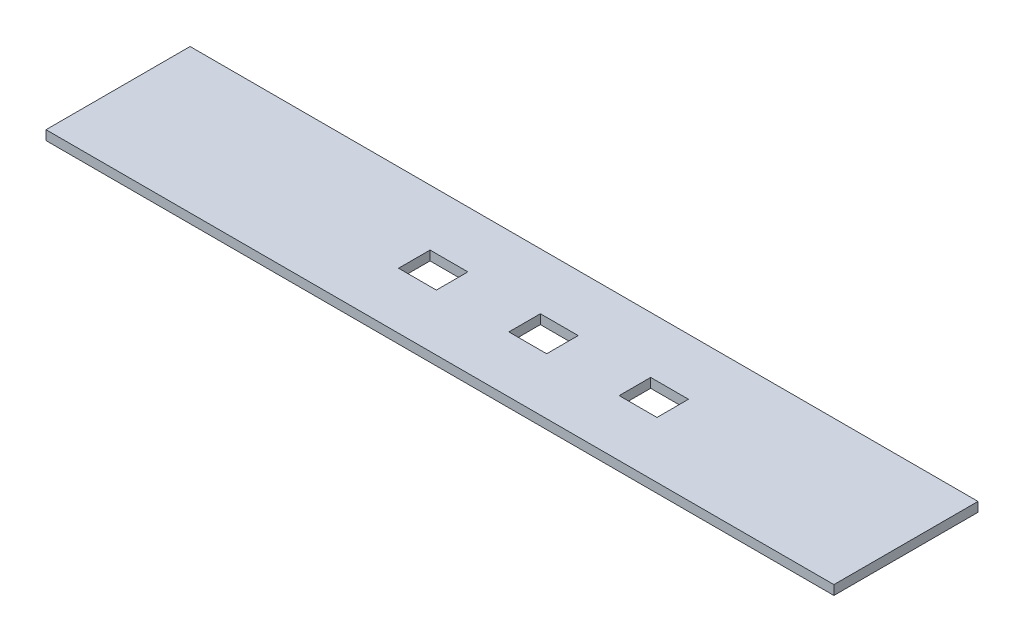
ISO-10303-21;
HEADER;
FILE_DESCRIPTION(('STEP AP214'),'2;1');
FILE_NAME('part.step','',(''),(''),'','','');
FILE_SCHEMA(('AUTOMOTIVE_DESIGN { 1 0 10303 214 1 1 1 1 }'));
ENDSEC;
DATA;
#1=APPLICATION_CONTEXT('core data for automotive mechanical design processes');
#2=APPLICATION_PROTOCOL_DEFINITION('international standard','automotive_design',2000,#1);
#3=PRODUCT_CONTEXT('',#1,'mechanical');
#4=PRODUCT('Part','Part','',(#3));
#5=PRODUCT_RELATED_PRODUCT_CATEGORY('part','',(#4));
#6=PRODUCT_DEFINITION_FORMATION('','',#4);
#7=PRODUCT_DEFINITION_CONTEXT('part definition',#1,'design');
#8=PRODUCT_DEFINITION('design','',#6,#7);
#9=PRODUCT_DEFINITION_SHAPE('','',#8);
#10=(LENGTH_UNIT() NAMED_UNIT(*) SI_UNIT(.MILLI.,.METRE.));
#11=(NAMED_UNIT(*) PLANE_ANGLE_UNIT() SI_UNIT($,.RADIAN.));
#12=(NAMED_UNIT(*) SI_UNIT($,.STERADIAN.) SOLID_ANGLE_UNIT());
#13=UNCERTAINTY_MEASURE_WITH_UNIT(LENGTH_MEASURE(1.E-05),#10,'distance_accuracy_value','');
#14=(GEOMETRIC_REPRESENTATION_CONTEXT(3) GLOBAL_UNCERTAINTY_ASSIGNED_CONTEXT((#13)) GLOBAL_UNIT_ASSIGNED_CONTEXT((#10,
#11,#12)) REPRESENTATION_CONTEXT('',''));
#15=CARTESIAN_POINT('',(0.,0.,0.));
#16=DIRECTION('',(0.,0.,1.));
#17=DIRECTION('',(1.,0.,0.));
#18=AXIS2_PLACEMENT_3D('',#15,#16,#17);
#19=CARTESIAN_POINT('',(-125.,3.,-22.86));
#20=DIRECTION('',(1.,0.,0.));
#21=DIRECTION('',(0.,0.,-1.));
#22=AXIS2_PLACEMENT_3D('',#19,#20,#21);
#23=PLANE('',#22);
#24=DIRECTION('',(0.,0.,1.));
#25=VECTOR('',#24,1.);
#26=CARTESIAN_POINT('',(-125.,0.,-22.86));
#27=LINE('',#26,#25);
#28=CARTESIAN_POINT('',(-125.,0.,-22.86));
#29=VERTEX_POINT('',#28);
#30=CARTESIAN_POINT('',(-125.,0.,22.86));
#31=VERTEX_POINT('',#30);
#32=EDGE_CURVE('E194',#29,#31,#27,.T.);
#33=ORIENTED_EDGE('',*,*,#32,.T.);
#34=DIRECTION('',(0.,-1.,0.));
#35=VECTOR('',#34,1.);
#36=CARTESIAN_POINT('',(-125.,3.,22.86));
#37=LINE('',#36,#35);
#38=CARTESIAN_POINT('',(-125.,3.,22.86));
#39=VERTEX_POINT('',#38);
#40=EDGE_CURVE('E292',#39,#31,#37,.T.);
#41=ORIENTED_EDGE('',*,*,#40,.F.);
#42=DIRECTION('',(0.,0.,1.));
#43=VECTOR('',#42,1.);
#44=CARTESIAN_POINT('',(-125.,3.,-22.86));
#45=LINE('',#44,#43);
#46=CARTESIAN_POINT('',(-125.,3.,-22.86));
#47=VERTEX_POINT('',#46);
#48=EDGE_CURVE('E253',#47,#39,#45,.T.);
#49=ORIENTED_EDGE('',*,*,#48,.F.);
#50=DIRECTION('',(0.,-1.,0.));
#51=VECTOR('',#50,1.);
#52=CARTESIAN_POINT('',(-125.,3.,-22.86));
#53=LINE('',#52,#51);
#54=EDGE_CURVE('E269',#47,#29,#53,.T.);
#55=ORIENTED_EDGE('',*,*,#54,.T.);
#56=EDGE_LOOP('',(#33,#41,#49,#55));
#57=FACE_BOUND('',#56,.T.);
#58=ADVANCED_FACE('F45',(#57),#23,.F.);
#59=CARTESIAN_POINT('',(-125.,3.,22.86));
#60=DIRECTION('',(0.,0.,-1.));
#61=DIRECTION('',(-1.,0.,0.));
#62=AXIS2_PLACEMENT_3D('',#59,#60,#61);
#63=PLANE('',#62);
#64=DIRECTION('',(1.,0.,0.));
#65=VECTOR('',#64,1.);
#66=CARTESIAN_POINT('',(-125.,0.,22.86));
#67=LINE('',#66,#65);
#68=CARTESIAN_POINT('',(125.,0.,22.86));
#69=VERTEX_POINT('',#68);
#70=EDGE_CURVE('E273',#31,#69,#67,.T.);
#71=ORIENTED_EDGE('',*,*,#70,.T.);
#72=DIRECTION('',(0.,-1.,0.));
#73=VECTOR('',#72,1.);
#74=CARTESIAN_POINT('',(125.,3.,22.86));
#75=LINE('',#74,#73);
#76=CARTESIAN_POINT('',(125.,3.,22.86));
#77=VERTEX_POINT('',#76);
#78=EDGE_CURVE('E289',#77,#69,#75,.T.);
#79=ORIENTED_EDGE('',*,*,#78,.F.);
#80=DIRECTION('',(1.,0.,0.));
#81=VECTOR('',#80,1.);
#82=CARTESIAN_POINT('',(-125.,3.,22.86));
#83=LINE('',#82,#81);
#84=EDGE_CURVE('E257',#39,#77,#83,.T.);
#85=ORIENTED_EDGE('',*,*,#84,.F.);
#86=ORIENTED_EDGE('',*,*,#40,.T.);
#87=EDGE_LOOP('',(#71,#79,#85,#86));
#88=FACE_BOUND('',#87,.T.);
#89=ADVANCED_FACE('F355',(#88),#63,.F.);
#90=CARTESIAN_POINT('',(125.,3.,-22.86));
#91=DIRECTION('',(1.,0.,0.));
#92=DIRECTION('',(0.,0.,-1.));
#93=AXIS2_PLACEMENT_3D('',#90,#91,#92);
#94=PLANE('',#93);
#95=DIRECTION('',(0.,0.,1.));
#96=VECTOR('',#95,1.);
#97=CARTESIAN_POINT('',(125.,0.,-22.86));
#98=LINE('',#97,#96);
#99=CARTESIAN_POINT('',(125.,0.,-22.86));
#100=VERTEX_POINT('',#99);
#101=EDGE_CURVE('E277',#100,#69,#98,.T.);
#102=ORIENTED_EDGE('',*,*,#101,.F.);
#103=DIRECTION('',(0.,-1.,0.));
#104=VECTOR('',#103,1.);
#105=CARTESIAN_POINT('',(125.,3.,-22.86));
#106=LINE('',#105,#104);
#107=CARTESIAN_POINT('',(125.,3.,-22.86));
#108=VERTEX_POINT('',#107);
#109=EDGE_CURVE('E286',#108,#100,#106,.T.);
#110=ORIENTED_EDGE('',*,*,#109,.F.);
#111=DIRECTION('',(0.,0.,1.));
#112=VECTOR('',#111,1.);
#113=CARTESIAN_POINT('',(125.,3.,-22.86));
#114=LINE('',#113,#112);
#115=EDGE_CURVE('E261',#108,#77,#114,.T.);
#116=ORIENTED_EDGE('',*,*,#115,.T.);
#117=ORIENTED_EDGE('',*,*,#78,.T.);
#118=EDGE_LOOP('',(#102,#110,#116,#117));
#119=FACE_BOUND('',#118,.T.);
#120=ADVANCED_FACE('F360',(#119),#94,.T.);
#121=CARTESIAN_POINT('',(-125.,3.,-22.86));
#122=DIRECTION('',(0.,0.,-1.));
#123=DIRECTION('',(-1.,0.,0.));
#124=AXIS2_PLACEMENT_3D('',#121,#122,#123);
#125=PLANE('',#124);
#126=DIRECTION('',(1.,0.,0.));
#127=VECTOR('',#126,1.);
#128=CARTESIAN_POINT('',(-125.,0.,-22.86));
#129=LINE('',#128,#127);
#130=EDGE_CURVE('E258',#29,#100,#129,.T.);
#131=ORIENTED_EDGE('',*,*,#130,.F.);
#132=ORIENTED_EDGE('',*,*,#54,.F.);
#133=DIRECTION('',(1.,0.,0.));
#134=VECTOR('',#133,1.);
#135=CARTESIAN_POINT('',(-125.,3.,-22.86));
#136=LINE('',#135,#134);
#137=EDGE_CURVE('E265',#47,#108,#136,.T.);
#138=ORIENTED_EDGE('',*,*,#137,.T.);
#139=ORIENTED_EDGE('',*,*,#109,.T.);
#140=EDGE_LOOP('',(#131,#132,#138,#139));
#141=FACE_BOUND('',#140,.T.);
#142=ADVANCED_FACE('F368',(#141),#125,.T.);
#143=CARTESIAN_POINT('',(0.,3.,0.));
#144=DIRECTION('',(0.,1.,0.));
#145=DIRECTION('',(0.,0.,1.));
#146=AXIS2_PLACEMENT_3D('',#143,#144,#145);
#147=PLANE('',#146);
#148=DIRECTION('',(0.,0.,-1.));
#149=VECTOR('',#148,1.);
#150=CARTESIAN_POINT('',(-19.,3.,-5.));
#151=LINE('',#150,#149);
#152=CARTESIAN_POINT('',(-19.,3.,5.));
#153=VERTEX_POINT('',#152);
#154=CARTESIAN_POINT('',(-19.,3.,-5.));
#155=VERTEX_POINT('',#154);
#156=EDGE_CURVE('E60',#153,#155,#151,.T.);
#157=ORIENTED_EDGE('',*,*,#156,.F.);
#158=DIRECTION('',(1.,0.,0.));
#159=VECTOR('',#158,1.);
#160=CARTESIAN_POINT('',(-31.,3.,5.));
#161=LINE('',#160,#159);
#162=CARTESIAN_POINT('',(-31.,3.,5.));
#163=VERTEX_POINT('',#162);
#164=EDGE_CURVE('E184',#163,#153,#161,.T.);
#165=ORIENTED_EDGE('',*,*,#164,.F.);
#166=DIRECTION('',(0.,0.,1.));
#167=VECTOR('',#166,1.);
#168=CARTESIAN_POINT('',(-31.,3.,-5.));
#169=LINE('',#168,#167);
#170=CARTESIAN_POINT('',(-31.,3.,-5.));
#171=VERTEX_POINT('',#170);
#172=EDGE_CURVE('E165',#171,#163,#169,.T.);
#173=ORIENTED_EDGE('',*,*,#172,.F.);
#174=DIRECTION('',(-1.,0.,0.));
#175=VECTOR('',#174,1.);
#176=CARTESIAN_POINT('',(-31.,3.,-5.));
#177=LINE('',#176,#175);
#178=EDGE_CURVE('E176',#155,#171,#177,.T.);
#179=ORIENTED_EDGE('',*,*,#178,.F.);
#180=EDGE_LOOP('',(#157,#165,#173,#179));
#181=FACE_BOUND('',#180,.T.);
#182=DIRECTION('',(0.,0.,-1.));
#183=VECTOR('',#182,1.);
#184=CARTESIAN_POINT('',(16.,3.,-5.));
#185=LINE('',#184,#183);
#186=CARTESIAN_POINT('',(16.,3.,5.));
#187=VERTEX_POINT('',#186);
#188=CARTESIAN_POINT('',(16.,3.,-5.));
#189=VERTEX_POINT('',#188);
#190=EDGE_CURVE('E68',#187,#189,#185,.T.);
#191=ORIENTED_EDGE('',*,*,#190,.F.);
#192=DIRECTION('',(1.,0.,0.));
#193=VECTOR('',#192,1.);
#194=CARTESIAN_POINT('',(4.00000000000001,3.,5.));
#195=LINE('',#194,#193);
#196=CARTESIAN_POINT('',(4.00000000000001,3.,5.));
#197=VERTEX_POINT('',#196);
#198=EDGE_CURVE('E202',#197,#187,#195,.T.);
#199=ORIENTED_EDGE('',*,*,#198,.F.);
#200=DIRECTION('',(0.,0.,1.));
#201=VECTOR('',#200,1.);
#202=CARTESIAN_POINT('',(4.,3.,-5.));
#203=LINE('',#202,#201);
#204=CARTESIAN_POINT('',(4.,3.,-5.));
#205=VERTEX_POINT('',#204);
#206=EDGE_CURVE('E216',#205,#197,#203,.T.);
#207=ORIENTED_EDGE('',*,*,#206,.F.);
#208=DIRECTION('',(-1.,0.,0.));
#209=VECTOR('',#208,1.);
#210=CARTESIAN_POINT('',(4.,3.,-5.));
#211=LINE('',#210,#209);
#212=EDGE_CURVE('E220',#189,#205,#211,.T.);
#213=ORIENTED_EDGE('',*,*,#212,.F.);
#214=EDGE_LOOP('',(#191,#199,#207,#213));
#215=FACE_BOUND('',#214,.T.);
#216=DIRECTION('',(0.,0.,-1.));
#217=VECTOR('',#216,1.);
#218=CARTESIAN_POINT('',(51.,3.,-5.00000000000001));
#219=LINE('',#218,#217);
#220=CARTESIAN_POINT('',(51.,3.,4.99999999999999));
#221=VERTEX_POINT('',#220);
#222=CARTESIAN_POINT('',(51.,3.,-5.00000000000001));
#223=VERTEX_POINT('',#222);
#224=EDGE_CURVE('E212',#221,#223,#219,.T.);
#225=ORIENTED_EDGE('',*,*,#224,.F.);
#226=DIRECTION('',(1.,0.,0.));
#227=VECTOR('',#226,1.);
#228=CARTESIAN_POINT('',(39.,3.,4.99999999999999));
#229=LINE('',#228,#227);
#230=CARTESIAN_POINT('',(39.,3.,4.99999999999999));
#231=VERTEX_POINT('',#230);
#232=EDGE_CURVE('E230',#231,#221,#229,.T.);
#233=ORIENTED_EDGE('',*,*,#232,.F.);
#234=DIRECTION('',(0.,0.,1.));
#235=VECTOR('',#234,1.);
#236=CARTESIAN_POINT('',(39.,3.,-5.00000000000001));
#237=LINE('',#236,#235);
#238=CARTESIAN_POINT('',(39.,3.,-5.00000000000001));
#239=VERTEX_POINT('',#238);
#240=EDGE_CURVE('E243',#239,#231,#237,.T.);
#241=ORIENTED_EDGE('',*,*,#240,.F.);
#242=DIRECTION('',(-1.,0.,0.));
#243=VECTOR('',#242,1.);
#244=CARTESIAN_POINT('',(39.,3.,-5.00000000000001));
#245=LINE('',#244,#243);
#246=EDGE_CURVE('E247',#223,#239,#245,.T.);
#247=ORIENTED_EDGE('',*,*,#246,.F.);
#248=EDGE_LOOP('',(#225,#233,#241,#247));
#249=FACE_BOUND('',#248,.T.);
#250=ORIENTED_EDGE('',*,*,#48,.T.);
#251=ORIENTED_EDGE('',*,*,#84,.T.);
#252=ORIENTED_EDGE('',*,*,#115,.F.);
#253=ORIENTED_EDGE('',*,*,#137,.F.);
#254=EDGE_LOOP('',(#250,#251,#252,#253));
#255=FACE_BOUND('',#254,.T.);
#256=ADVANCED_FACE('F181',(#181,#215,#249,#255),#147,.T.);
#257=CARTESIAN_POINT('',(0.,0.,0.));
#258=DIRECTION('',(0.,1.,0.));
#259=DIRECTION('',(0.,0.,1.));
#260=AXIS2_PLACEMENT_3D('',#257,#258,#259);
#261=PLANE('',#260);
#262=DIRECTION('',(1.,0.,0.));
#263=VECTOR('',#262,1.);
#264=CARTESIAN_POINT('',(0.,0.,5.));
#265=LINE('',#264,#263);
#266=CARTESIAN_POINT('',(-31.,0.,5.));
#267=VERTEX_POINT('',#266);
#268=CARTESIAN_POINT('',(-19.,0.,5.));
#269=VERTEX_POINT('',#268);
#270=EDGE_CURVE('E53',#267,#269,#265,.T.);
#271=ORIENTED_EDGE('',*,*,#270,.T.);
#272=DIRECTION('',(0.,0.,-1.));
#273=VECTOR('',#272,1.);
#274=CARTESIAN_POINT('',(-19.,0.,0.));
#275=LINE('',#274,#273);
#276=CARTESIAN_POINT('',(-19.,0.,-5.));
#277=VERTEX_POINT('',#276);
#278=EDGE_CURVE('E11',#269,#277,#275,.T.);
#279=ORIENTED_EDGE('',*,*,#278,.T.);
#280=DIRECTION('',(-1.,0.,0.));
#281=VECTOR('',#280,1.);
#282=CARTESIAN_POINT('',(0.,0.,-5.));
#283=LINE('',#282,#281);
#284=CARTESIAN_POINT('',(-31.,0.,-5.));
#285=VERTEX_POINT('',#284);
#286=EDGE_CURVE('E328',#277,#285,#283,.T.);
#287=ORIENTED_EDGE('',*,*,#286,.T.);
#288=DIRECTION('',(0.,0.,1.));
#289=VECTOR('',#288,1.);
#290=CARTESIAN_POINT('',(-31.,0.,0.));
#291=LINE('',#290,#289);
#292=EDGE_CURVE('E168',#285,#267,#291,.T.);
#293=ORIENTED_EDGE('',*,*,#292,.T.);
#294=EDGE_LOOP('',(#271,#279,#287,#293));
#295=FACE_BOUND('',#294,.T.);
#296=DIRECTION('',(1.,0.,0.));
#297=VECTOR('',#296,1.);
#298=CARTESIAN_POINT('',(0.,0.,5.));
#299=LINE('',#298,#297);
#300=CARTESIAN_POINT('',(4.00000000000001,0.,5.));
#301=VERTEX_POINT('',#300);
#302=CARTESIAN_POINT('',(16.,0.,5.));
#303=VERTEX_POINT('',#302);
#304=EDGE_CURVE('E320',#301,#303,#299,.T.);
#305=ORIENTED_EDGE('',*,*,#304,.T.);
#306=DIRECTION('',(0.,0.,-1.));
#307=VECTOR('',#306,1.);
#308=CARTESIAN_POINT('',(16.,0.,0.));
#309=LINE('',#308,#307);
#310=CARTESIAN_POINT('',(16.,0.,-5.));
#311=VERTEX_POINT('',#310);
#312=EDGE_CURVE('E324',#303,#311,#309,.T.);
#313=ORIENTED_EDGE('',*,*,#312,.T.);
#314=DIRECTION('',(-1.,0.,0.));
#315=VECTOR('',#314,1.);
#316=CARTESIAN_POINT('',(0.,0.,-5.));
#317=LINE('',#316,#315);
#318=CARTESIAN_POINT('',(4.,0.,-5.));
#319=VERTEX_POINT('',#318);
#320=EDGE_CURVE('E312',#311,#319,#317,.T.);
#321=ORIENTED_EDGE('',*,*,#320,.T.);
#322=DIRECTION('',(0.,0.,1.));
#323=VECTOR('',#322,1.);
#324=CARTESIAN_POINT('',(4.,0.,0.));
#325=LINE('',#324,#323);
#326=EDGE_CURVE('E316',#319,#301,#325,.T.);
#327=ORIENTED_EDGE('',*,*,#326,.T.);
#328=EDGE_LOOP('',(#305,#313,#321,#327));
#329=FACE_BOUND('',#328,.T.);
#330=DIRECTION('',(1.,0.,0.));
#331=VECTOR('',#330,1.);
#332=CARTESIAN_POINT('',(0.,0.,4.99999999999999));
#333=LINE('',#332,#331);
#334=CARTESIAN_POINT('',(39.,0.,4.99999999999999));
#335=VERTEX_POINT('',#334);
#336=CARTESIAN_POINT('',(51.,0.,4.99999999999999));
#337=VERTEX_POINT('',#336);
#338=EDGE_CURVE('E304',#335,#337,#333,.T.);
#339=ORIENTED_EDGE('',*,*,#338,.T.);
#340=DIRECTION('',(0.,0.,-1.));
#341=VECTOR('',#340,1.);
#342=CARTESIAN_POINT('',(51.,0.,0.));
#343=LINE('',#342,#341);
#344=CARTESIAN_POINT('',(51.,0.,-5.00000000000001));
#345=VERTEX_POINT('',#344);
#346=EDGE_CURVE('E308',#337,#345,#343,.T.);
#347=ORIENTED_EDGE('',*,*,#346,.T.);
#348=DIRECTION('',(-1.,0.,0.));
#349=VECTOR('',#348,1.);
#350=CARTESIAN_POINT('',(0.,0.,-5.00000000000001));
#351=LINE('',#350,#349);
#352=CARTESIAN_POINT('',(39.,0.,-5.00000000000001));
#353=VERTEX_POINT('',#352);
#354=EDGE_CURVE('E296',#345,#353,#351,.T.);
#355=ORIENTED_EDGE('',*,*,#354,.T.);
#356=DIRECTION('',(0.,0.,1.));
#357=VECTOR('',#356,1.);
#358=CARTESIAN_POINT('',(39.,0.,0.));
#359=LINE('',#358,#357);
#360=EDGE_CURVE('E300',#353,#335,#359,.T.);
#361=ORIENTED_EDGE('',*,*,#360,.T.);
#362=EDGE_LOOP('',(#339,#347,#355,#361));
#363=FACE_BOUND('',#362,.T.);
#364=ORIENTED_EDGE('',*,*,#32,.F.);
#365=ORIENTED_EDGE('',*,*,#130,.T.);
#366=ORIENTED_EDGE('',*,*,#101,.T.);
#367=ORIENTED_EDGE('',*,*,#70,.F.);
#368=EDGE_LOOP('',(#364,#365,#366,#367));
#369=FACE_BOUND('',#368,.T.);
#370=ADVANCED_FACE('F335',(#295,#329,#363,#369),#261,.F.);
#371=CARTESIAN_POINT('',(51.,-1.2E-05,-5.00000000000001));
#372=DIRECTION('',(1.,0.,0.));
#373=DIRECTION('',(0.,0.,-1.));
#374=AXIS2_PLACEMENT_3D('',#371,#372,#373);
#375=PLANE('',#374);
#376=DIRECTION('',(0.,1.,0.));
#377=VECTOR('',#376,1.);
#378=CARTESIAN_POINT('',(51.,-1.2E-05,4.99999999999999));
#379=LINE('',#378,#377);
#380=EDGE_CURVE('E237',#337,#221,#379,.T.);
#381=ORIENTED_EDGE('',*,*,#380,.T.);
#382=ORIENTED_EDGE('',*,*,#224,.T.);
#383=DIRECTION('',(0.,1.,0.));
#384=VECTOR('',#383,1.);
#385=CARTESIAN_POINT('',(51.,-1.2E-05,-5.00000000000001));
#386=LINE('',#385,#384);
#387=EDGE_CURVE('E226',#345,#223,#386,.T.);
#388=ORIENTED_EDGE('',*,*,#387,.F.);
#389=ORIENTED_EDGE('',*,*,#346,.F.);
#390=EDGE_LOOP('',(#381,#382,#388,#389));
#391=FACE_BOUND('',#390,.T.);
#392=ADVANCED_FACE('F381',(#391),#375,.F.);
#393=CARTESIAN_POINT('',(39.,-1.2E-05,4.99999999999999));
#394=DIRECTION('',(0.,0.,1.));
#395=DIRECTION('',(1.,0.,0.));
#396=AXIS2_PLACEMENT_3D('',#393,#394,#395);
#397=PLANE('',#396);
#398=DIRECTION('',(0.,1.,0.));
#399=VECTOR('',#398,1.);
#400=CARTESIAN_POINT('',(39.,-1.2E-05,4.99999999999999));
#401=LINE('',#400,#399);
#402=EDGE_CURVE('E234',#335,#231,#401,.T.);
#403=ORIENTED_EDGE('',*,*,#402,.T.);
#404=ORIENTED_EDGE('',*,*,#232,.T.);
#405=ORIENTED_EDGE('',*,*,#380,.F.);
#406=ORIENTED_EDGE('',*,*,#338,.F.);
#407=EDGE_LOOP('',(#403,#404,#405,#406));
#408=FACE_BOUND('',#407,.T.);
#409=ADVANCED_FACE('F385',(#408),#397,.F.);
#410=CARTESIAN_POINT('',(39.,-1.2E-05,-5.00000000000001));
#411=DIRECTION('',(-1.,0.,0.));
#412=DIRECTION('',(0.,0.,1.));
#413=AXIS2_PLACEMENT_3D('',#410,#411,#412);
#414=PLANE('',#413);
#415=DIRECTION('',(0.,1.,0.));
#416=VECTOR('',#415,1.);
#417=CARTESIAN_POINT('',(39.,-1.2E-05,-5.00000000000001));
#418=LINE('',#417,#416);
#419=EDGE_CURVE('E231',#353,#239,#418,.T.);
#420=ORIENTED_EDGE('',*,*,#419,.T.);
#421=ORIENTED_EDGE('',*,*,#240,.T.);
#422=ORIENTED_EDGE('',*,*,#402,.F.);
#423=ORIENTED_EDGE('',*,*,#360,.F.);
#424=EDGE_LOOP('',(#420,#421,#422,#423));
#425=FACE_BOUND('',#424,.T.);
#426=ADVANCED_FACE('F427',(#425),#414,.F.);
#427=CARTESIAN_POINT('',(39.,-1.2E-05,-5.00000000000001));
#428=DIRECTION('',(0.,0.,-1.));
#429=DIRECTION('',(-1.,0.,0.));
#430=AXIS2_PLACEMENT_3D('',#427,#428,#429);
#431=PLANE('',#430);
#432=ORIENTED_EDGE('',*,*,#387,.T.);
#433=ORIENTED_EDGE('',*,*,#246,.T.);
#434=ORIENTED_EDGE('',*,*,#419,.F.);
#435=ORIENTED_EDGE('',*,*,#354,.F.);
#436=EDGE_LOOP('',(#432,#433,#434,#435));
#437=FACE_BOUND('',#436,.T.);
#438=ADVANCED_FACE('F436',(#437),#431,.F.);
#439=CARTESIAN_POINT('',(16.,-1.2E-05,-5.));
#440=DIRECTION('',(1.,0.,0.));
#441=DIRECTION('',(0.,0.,-1.));
#442=AXIS2_PLACEMENT_3D('',#439,#440,#441);
#443=PLANE('',#442);
#444=DIRECTION('',(0.,1.,0.));
#445=VECTOR('',#444,1.);
#446=CARTESIAN_POINT('',(16.,-1.2E-05,5.));
#447=LINE('',#446,#445);
#448=EDGE_CURVE('E209',#303,#187,#447,.T.);
#449=ORIENTED_EDGE('',*,*,#448,.T.);
#450=ORIENTED_EDGE('',*,*,#190,.T.);
#451=DIRECTION('',(0.,1.,0.));
#452=VECTOR('',#451,1.);
#453=CARTESIAN_POINT('',(16.,-1.2E-05,-5.));
#454=LINE('',#453,#452);
#455=EDGE_CURVE('E199',#311,#189,#454,.T.);
#456=ORIENTED_EDGE('',*,*,#455,.F.);
#457=ORIENTED_EDGE('',*,*,#312,.F.);
#458=EDGE_LOOP('',(#449,#450,#456,#457));
#459=FACE_BOUND('',#458,.T.);
#460=ADVANCED_FACE('F445',(#459),#443,.F.);
#461=CARTESIAN_POINT('',(4.00000000000001,-1.2E-05,5.));
#462=DIRECTION('',(0.,0.,1.));
#463=DIRECTION('',(1.,0.,0.));
#464=AXIS2_PLACEMENT_3D('',#461,#462,#463);
#465=PLANE('',#464);
#466=DIRECTION('',(0.,1.,0.));
#467=VECTOR('',#466,1.);
#468=CARTESIAN_POINT('',(4.00000000000001,-1.2E-05,5.));
#469=LINE('',#468,#467);
#470=EDGE_CURVE('E206',#301,#197,#469,.T.);
#471=ORIENTED_EDGE('',*,*,#470,.T.);
#472=ORIENTED_EDGE('',*,*,#198,.T.);
#473=ORIENTED_EDGE('',*,*,#448,.F.);
#474=ORIENTED_EDGE('',*,*,#304,.F.);
#475=EDGE_LOOP('',(#471,#472,#473,#474));
#476=FACE_BOUND('',#475,.T.);
#477=ADVANCED_FACE('F455',(#476),#465,.F.);
#478=CARTESIAN_POINT('',(4.,-1.2E-05,-5.));
#479=DIRECTION('',(-1.,0.,0.));
#480=DIRECTION('',(0.,0.,1.));
#481=AXIS2_PLACEMENT_3D('',#478,#479,#480);
#482=PLANE('',#481);
#483=DIRECTION('',(0.,1.,0.));
#484=VECTOR('',#483,1.);
#485=CARTESIAN_POINT('',(4.,-1.2E-05,-5.));
#486=LINE('',#485,#484);
#487=EDGE_CURVE('E203',#319,#205,#486,.T.);
#488=ORIENTED_EDGE('',*,*,#487,.T.);
#489=ORIENTED_EDGE('',*,*,#206,.T.);
#490=ORIENTED_EDGE('',*,*,#470,.F.);
#491=ORIENTED_EDGE('',*,*,#326,.F.);
#492=EDGE_LOOP('',(#488,#489,#490,#491));
#493=FACE_BOUND('',#492,.T.);
#494=ADVANCED_FACE('F349',(#493),#482,.F.);
#495=CARTESIAN_POINT('',(4.,-1.2E-05,-5.));
#496=DIRECTION('',(0.,0.,-1.));
#497=DIRECTION('',(-1.,0.,0.));
#498=AXIS2_PLACEMENT_3D('',#495,#496,#497);
#499=PLANE('',#498);
#500=ORIENTED_EDGE('',*,*,#455,.T.);
#501=ORIENTED_EDGE('',*,*,#212,.T.);
#502=ORIENTED_EDGE('',*,*,#487,.F.);
#503=ORIENTED_EDGE('',*,*,#320,.F.);
#504=EDGE_LOOP('',(#500,#501,#502,#503));
#505=FACE_BOUND('',#504,.T.);
#506=ADVANCED_FACE('F342',(#505),#499,.F.);
#507=CARTESIAN_POINT('',(-19.,-1.2E-05,-5.));
#508=DIRECTION('',(1.,0.,0.));
#509=DIRECTION('',(0.,0.,-1.));
#510=AXIS2_PLACEMENT_3D('',#507,#508,#509);
#511=PLANE('',#510);
#512=DIRECTION('',(0.,1.,0.));
#513=VECTOR('',#512,1.);
#514=CARTESIAN_POINT('',(-19.,-1.2E-05,5.));
#515=LINE('',#514,#513);
#516=EDGE_CURVE('E191',#269,#153,#515,.T.);
#517=ORIENTED_EDGE('',*,*,#516,.T.);
#518=ORIENTED_EDGE('',*,*,#156,.T.);
#519=DIRECTION('',(0.,1.,0.));
#520=VECTOR('',#519,1.);
#521=CARTESIAN_POINT('',(-19.,-1.2E-05,-5.));
#522=LINE('',#521,#520);
#523=EDGE_CURVE('E173',#277,#155,#522,.T.);
#524=ORIENTED_EDGE('',*,*,#523,.F.);
#525=ORIENTED_EDGE('',*,*,#278,.F.);
#526=EDGE_LOOP('',(#517,#518,#524,#525));
#527=FACE_BOUND('',#526,.T.);
#528=ADVANCED_FACE('F340',(#527),#511,.F.);
#529=CARTESIAN_POINT('',(-31.,-1.2E-05,5.));
#530=DIRECTION('',(0.,0.,1.));
#531=DIRECTION('',(1.,0.,0.));
#532=AXIS2_PLACEMENT_3D('',#529,#530,#531);
#533=PLANE('',#532);
#534=DIRECTION('',(0.,1.,0.));
#535=VECTOR('',#534,1.);
#536=CARTESIAN_POINT('',(-31.,-1.2E-05,5.));
#537=LINE('',#536,#535);
#538=EDGE_CURVE('E172',#267,#163,#537,.T.);
#539=ORIENTED_EDGE('',*,*,#538,.T.);
#540=ORIENTED_EDGE('',*,*,#164,.T.);
#541=ORIENTED_EDGE('',*,*,#516,.F.);
#542=ORIENTED_EDGE('',*,*,#270,.F.);
#543=EDGE_LOOP('',(#539,#540,#541,#542));
#544=FACE_BOUND('',#543,.T.);
#545=ADVANCED_FACE('F339',(#544),#533,.F.);
#546=CARTESIAN_POINT('',(-31.,-1.2E-05,-5.));
#547=DIRECTION('',(-1.,0.,0.));
#548=DIRECTION('',(0.,0.,1.));
#549=AXIS2_PLACEMENT_3D('',#546,#547,#548);
#550=PLANE('',#549);
#551=DIRECTION('',(0.,1.,0.));
#552=VECTOR('',#551,1.);
#553=CARTESIAN_POINT('',(-31.,-1.2E-05,-5.));
#554=LINE('',#553,#552);
#555=EDGE_CURVE('E160',#285,#171,#554,.T.);
#556=ORIENTED_EDGE('',*,*,#555,.T.);
#557=ORIENTED_EDGE('',*,*,#172,.T.);
#558=ORIENTED_EDGE('',*,*,#538,.F.);
#559=ORIENTED_EDGE('',*,*,#292,.F.);
#560=EDGE_LOOP('',(#556,#557,#558,#559));
#561=FACE_BOUND('',#560,.T.);
#562=ADVANCED_FACE('F162',(#561),#550,.F.);
#563=CARTESIAN_POINT('',(-31.,-1.2E-05,-5.));
#564=DIRECTION('',(0.,0.,-1.));
#565=DIRECTION('',(-1.,0.,0.));
#566=AXIS2_PLACEMENT_3D('',#563,#564,#565);
#567=PLANE('',#566);
#568=ORIENTED_EDGE('',*,*,#523,.T.);
#569=ORIENTED_EDGE('',*,*,#178,.T.);
#570=ORIENTED_EDGE('',*,*,#555,.F.);
#571=ORIENTED_EDGE('',*,*,#286,.F.);
#572=EDGE_LOOP('',(#568,#569,#570,#571));
#573=FACE_BOUND('',#572,.T.);
#574=ADVANCED_FACE('F177',(#573),#567,.F.);
#575=CLOSED_SHELL('',(#58,#89,#120,#142,#256,#370,#392,#409,#426,#438,#460,#477,#494,#506,#528,
#545,#562,#574));
#576=MANIFOLD_SOLID_BREP('B2',#575);
#577=ADVANCED_BREP_SHAPE_REPRESENTATION('',(#18,#576),#14);
#578=SHAPE_DEFINITION_REPRESENTATION(#9,#577);
ENDSEC;
END-ISO-10303-21;
